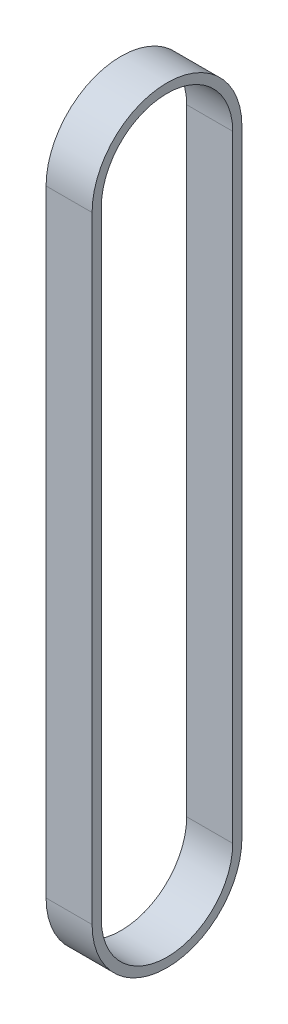
ISO-10303-21;
HEADER;
FILE_DESCRIPTION(('STEP AP214'),'2;1');
FILE_NAME('part.step','',(''),(''),'','','');
FILE_SCHEMA(('AUTOMOTIVE_DESIGN { 1 0 10303 214 1 1 1 1 }'));
ENDSEC;
DATA;
#1=APPLICATION_CONTEXT('core data for automotive mechanical design processes');
#2=APPLICATION_PROTOCOL_DEFINITION('international standard','automotive_design',2000,#1);
#3=PRODUCT_CONTEXT('',#1,'mechanical');
#4=PRODUCT('Part','Part','',(#3));
#5=PRODUCT_RELATED_PRODUCT_CATEGORY('part','',(#4));
#6=PRODUCT_DEFINITION_FORMATION('','',#4);
#7=PRODUCT_DEFINITION_CONTEXT('part definition',#1,'design');
#8=PRODUCT_DEFINITION('design','',#6,#7);
#9=PRODUCT_DEFINITION_SHAPE('','',#8);
#10=(LENGTH_UNIT() NAMED_UNIT(*) SI_UNIT(.MILLI.,.METRE.));
#11=(NAMED_UNIT(*) PLANE_ANGLE_UNIT() SI_UNIT($,.RADIAN.));
#12=(NAMED_UNIT(*) SI_UNIT($,.STERADIAN.) SOLID_ANGLE_UNIT());
#13=UNCERTAINTY_MEASURE_WITH_UNIT(LENGTH_MEASURE(1.E-05),#10,'distance_accuracy_value','');
#14=(GEOMETRIC_REPRESENTATION_CONTEXT(3) GLOBAL_UNCERTAINTY_ASSIGNED_CONTEXT((#13)) GLOBAL_UNIT_ASSIGNED_CONTEXT((#10,
#11,#12)) REPRESENTATION_CONTEXT('',''));
#15=CARTESIAN_POINT('',(0.,0.,0.));
#16=DIRECTION('',(0.,0.,1.));
#17=DIRECTION('',(1.,0.,0.));
#18=AXIS2_PLACEMENT_3D('',#15,#16,#17);
#19=CARTESIAN_POINT('',(3.175,0.,0.));
#20=DIRECTION('',(-1.,0.,0.));
#21=DIRECTION('',(0.,0.,1.));
#22=AXIS2_PLACEMENT_3D('',#19,#20,#21);
#23=PLANE('',#22);
#24=CARTESIAN_POINT('',(3.175,0.,0.));
#25=DIRECTION('',(1.,0.,0.));
#26=DIRECTION('',(0.,0.,1.));
#27=AXIS2_PLACEMENT_3D('',#24,#25,#26);
#28=CIRCLE('',#27,5.1689);
#29=CARTESIAN_POINT('',(3.175,0.,-5.1689));
#30=VERTEX_POINT('',#29);
#31=CARTESIAN_POINT('',(3.175,0.,5.1689));
#32=VERTEX_POINT('',#31);
#33=EDGE_CURVE('E133',#30,#32,#28,.T.);
#34=ORIENTED_EDGE('',*,*,#33,.T.);
#35=DIRECTION('',(0.,-1.,0.));
#36=VECTOR('',#35,1.);
#37=CARTESIAN_POINT('',(3.175,-42.545,5.1689));
#38=LINE('',#37,#36);
#39=CARTESIAN_POINT('',(3.175,-42.545,5.1689));
#40=VERTEX_POINT('',#39);
#41=EDGE_CURVE('E136',#32,#40,#38,.T.);
#42=ORIENTED_EDGE('',*,*,#41,.T.);
#43=CARTESIAN_POINT('',(3.175,-42.545,0.));
#44=DIRECTION('',(1.,0.,0.));
#45=DIRECTION('',(0.,0.,1.));
#46=AXIS2_PLACEMENT_3D('',#43,#44,#45);
#47=CIRCLE('',#46,5.1689);
#48=CARTESIAN_POINT('',(3.175,-42.545,-5.1689));
#49=VERTEX_POINT('',#48);
#50=EDGE_CURVE('E139',#40,#49,#47,.T.);
#51=ORIENTED_EDGE('',*,*,#50,.T.);
#52=DIRECTION('',(0.,1.,0.));
#53=VECTOR('',#52,1.);
#54=CARTESIAN_POINT('',(3.175,0.,-5.1689));
#55=LINE('',#54,#53);
#56=EDGE_CURVE('E141',#49,#30,#55,.T.);
#57=ORIENTED_EDGE('',*,*,#56,.T.);
#58=EDGE_LOOP('',(#34,#42,#51,#57));
#59=FACE_BOUND('',#58,.T.);
#60=CARTESIAN_POINT('',(3.175,0.,0.));
#61=DIRECTION('',(1.,0.,0.));
#62=DIRECTION('',(0.,0.,1.));
#63=AXIS2_PLACEMENT_3D('',#60,#61,#62);
#64=CIRCLE('',#63,4.5339);
#65=CARTESIAN_POINT('',(3.175,0.,-4.5339));
#66=VERTEX_POINT('',#65);
#67=CARTESIAN_POINT('',(3.175,0.,4.5339));
#68=VERTEX_POINT('',#67);
#69=EDGE_CURVE('E97',#66,#68,#64,.T.);
#70=ORIENTED_EDGE('',*,*,#69,.F.);
#71=DIRECTION('',(0.,1.,0.));
#72=VECTOR('',#71,1.);
#73=CARTESIAN_POINT('',(3.175,0.,-4.5339));
#74=LINE('',#73,#72);
#75=CARTESIAN_POINT('',(3.175,-42.545,-4.5339));
#76=VERTEX_POINT('',#75);
#77=EDGE_CURVE('E119',#76,#66,#74,.T.);
#78=ORIENTED_EDGE('',*,*,#77,.F.);
#79=CARTESIAN_POINT('',(3.175,-42.545,0.));
#80=DIRECTION('',(1.,0.,0.));
#81=DIRECTION('',(0.,0.,1.));
#82=AXIS2_PLACEMENT_3D('',#79,#80,#81);
#83=CIRCLE('',#82,4.5339);
#84=CARTESIAN_POINT('',(3.175,-42.545,4.5339));
#85=VERTEX_POINT('',#84);
#86=EDGE_CURVE('E117',#85,#76,#83,.T.);
#87=ORIENTED_EDGE('',*,*,#86,.F.);
#88=DIRECTION('',(0.,-1.,0.));
#89=VECTOR('',#88,1.);
#90=CARTESIAN_POINT('',(3.175,-42.545,4.5339));
#91=LINE('',#90,#89);
#92=EDGE_CURVE('E105',#68,#85,#91,.T.);
#93=ORIENTED_EDGE('',*,*,#92,.F.);
#94=EDGE_LOOP('',(#70,#78,#87,#93));
#95=FACE_BOUND('',#94,.T.);
#96=ADVANCED_FACE('F32',(#59,#95),#23,.F.);
#97=CARTESIAN_POINT('',(0.,0.,0.));
#98=DIRECTION('',(-1.,0.,0.));
#99=DIRECTION('',(0.,0.,1.));
#100=AXIS2_PLACEMENT_3D('',#97,#98,#99);
#101=PLANE('',#100);
#102=CARTESIAN_POINT('',(0.,0.,0.));
#103=DIRECTION('',(1.,0.,0.));
#104=DIRECTION('',(0.,0.,1.));
#105=AXIS2_PLACEMENT_3D('',#102,#103,#104);
#106=CIRCLE('',#105,5.1689);
#107=CARTESIAN_POINT('',(0.,0.,-5.1689));
#108=VERTEX_POINT('',#107);
#109=CARTESIAN_POINT('',(0.,0.,5.1689));
#110=VERTEX_POINT('',#109);
#111=EDGE_CURVE('E113',#108,#110,#106,.T.);
#112=ORIENTED_EDGE('',*,*,#111,.F.);
#113=DIRECTION('',(0.,1.,0.));
#114=VECTOR('',#113,1.);
#115=CARTESIAN_POINT('',(0.,0.,-5.1689));
#116=LINE('',#115,#114);
#117=CARTESIAN_POINT('',(0.,-42.545,-5.1689));
#118=VERTEX_POINT('',#117);
#119=EDGE_CURVE('E137',#118,#108,#116,.T.);
#120=ORIENTED_EDGE('',*,*,#119,.F.);
#121=CARTESIAN_POINT('',(0.,-42.545,0.));
#122=DIRECTION('',(1.,0.,0.));
#123=DIRECTION('',(0.,0.,1.));
#124=AXIS2_PLACEMENT_3D('',#121,#122,#123);
#125=CIRCLE('',#124,5.1689);
#126=CARTESIAN_POINT('',(0.,-42.545,5.1689));
#127=VERTEX_POINT('',#126);
#128=EDGE_CURVE('E148',#127,#118,#125,.T.);
#129=ORIENTED_EDGE('',*,*,#128,.F.);
#130=DIRECTION('',(0.,-1.,0.));
#131=VECTOR('',#130,1.);
#132=CARTESIAN_POINT('',(0.,-42.545,5.1689));
#133=LINE('',#132,#131);
#134=EDGE_CURVE('E146',#110,#127,#133,.T.);
#135=ORIENTED_EDGE('',*,*,#134,.F.);
#136=EDGE_LOOP('',(#112,#120,#129,#135));
#137=FACE_BOUND('',#136,.T.);
#138=DIRECTION('',(0.,1.,0.));
#139=VECTOR('',#138,1.);
#140=CARTESIAN_POINT('',(0.,0.,-4.5339));
#141=LINE('',#140,#139);
#142=CARTESIAN_POINT('',(0.,-42.545,-4.5339));
#143=VERTEX_POINT('',#142);
#144=CARTESIAN_POINT('',(0.,0.,-4.5339));
#145=VERTEX_POINT('',#144);
#146=EDGE_CURVE('E106',#143,#145,#141,.T.);
#147=ORIENTED_EDGE('',*,*,#146,.T.);
#148=CARTESIAN_POINT('',(0.,0.,0.));
#149=DIRECTION('',(1.,0.,0.));
#150=DIRECTION('',(0.,0.,1.));
#151=AXIS2_PLACEMENT_3D('',#148,#149,#150);
#152=CIRCLE('',#151,4.5339);
#153=CARTESIAN_POINT('',(0.,0.,4.5339));
#154=VERTEX_POINT('',#153);
#155=EDGE_CURVE('E55',#145,#154,#152,.T.);
#156=ORIENTED_EDGE('',*,*,#155,.T.);
#157=DIRECTION('',(0.,-1.,0.));
#158=VECTOR('',#157,1.);
#159=CARTESIAN_POINT('',(0.,-42.545,4.5339));
#160=LINE('',#159,#158);
#161=CARTESIAN_POINT('',(0.,-42.545,4.5339));
#162=VERTEX_POINT('',#161);
#163=EDGE_CURVE('E112',#154,#162,#160,.T.);
#164=ORIENTED_EDGE('',*,*,#163,.T.);
#165=CARTESIAN_POINT('',(0.,-42.545,0.));
#166=DIRECTION('',(1.,0.,0.));
#167=DIRECTION('',(0.,0.,1.));
#168=AXIS2_PLACEMENT_3D('',#165,#166,#167);
#169=CIRCLE('',#168,4.5339);
#170=EDGE_CURVE('E125',#162,#143,#169,.T.);
#171=ORIENTED_EDGE('',*,*,#170,.T.);
#172=EDGE_LOOP('',(#147,#156,#164,#171));
#173=FACE_BOUND('',#172,.T.);
#174=ADVANCED_FACE('F166',(#137,#173),#101,.T.);
#175=CARTESIAN_POINT('',(3.175,0.,0.));
#176=DIRECTION('',(-1.,0.,0.));
#177=DIRECTION('',(0.,0.,1.));
#178=AXIS2_PLACEMENT_3D('',#175,#176,#177);
#179=CYLINDRICAL_SURFACE('',#178,5.1689);
#180=ORIENTED_EDGE('',*,*,#111,.T.);
#181=DIRECTION('',(-1.,0.,0.));
#182=VECTOR('',#181,1.);
#183=CARTESIAN_POINT('',(3.175,0.,5.1689));
#184=LINE('',#183,#182);
#185=EDGE_CURVE('E11',#32,#110,#184,.T.);
#186=ORIENTED_EDGE('',*,*,#185,.F.);
#187=ORIENTED_EDGE('',*,*,#33,.F.);
#188=DIRECTION('',(-1.,0.,0.));
#189=VECTOR('',#188,1.);
#190=CARTESIAN_POINT('',(3.175,0.,-5.1689));
#191=LINE('',#190,#189);
#192=EDGE_CURVE('E143',#30,#108,#191,.T.);
#193=ORIENTED_EDGE('',*,*,#192,.T.);
#194=EDGE_LOOP('',(#180,#186,#187,#193));
#195=FACE_BOUND('',#194,.T.);
#196=ADVANCED_FACE('F34',(#195),#179,.T.);
#197=CARTESIAN_POINT('',(3.175,-42.545,5.1689));
#198=DIRECTION('',(0.,0.,-1.));
#199=DIRECTION('',(0.,1.,0.));
#200=AXIS2_PLACEMENT_3D('',#197,#198,#199);
#201=PLANE('',#200);
#202=ORIENTED_EDGE('',*,*,#134,.T.);
#203=DIRECTION('',(-1.,0.,0.));
#204=VECTOR('',#203,1.);
#205=CARTESIAN_POINT('',(3.175,-42.545,5.1689));
#206=LINE('',#205,#204);
#207=EDGE_CURVE('E40',#40,#127,#206,.T.);
#208=ORIENTED_EDGE('',*,*,#207,.F.);
#209=ORIENTED_EDGE('',*,*,#41,.F.);
#210=ORIENTED_EDGE('',*,*,#185,.T.);
#211=EDGE_LOOP('',(#202,#208,#209,#210));
#212=FACE_BOUND('',#211,.T.);
#213=ADVANCED_FACE('F176',(#212),#201,.F.);
#214=CARTESIAN_POINT('',(3.175,-42.545,0.));
#215=DIRECTION('',(-1.,0.,0.));
#216=DIRECTION('',(0.,0.,1.));
#217=AXIS2_PLACEMENT_3D('',#214,#215,#216);
#218=CYLINDRICAL_SURFACE('',#217,5.1689);
#219=ORIENTED_EDGE('',*,*,#128,.T.);
#220=DIRECTION('',(-1.,0.,0.));
#221=VECTOR('',#220,1.);
#222=CARTESIAN_POINT('',(3.175,-42.545,-5.1689));
#223=LINE('',#222,#221);
#224=EDGE_CURVE('E153',#49,#118,#223,.T.);
#225=ORIENTED_EDGE('',*,*,#224,.F.);
#226=ORIENTED_EDGE('',*,*,#50,.F.);
#227=ORIENTED_EDGE('',*,*,#207,.T.);
#228=EDGE_LOOP('',(#219,#225,#226,#227));
#229=FACE_BOUND('',#228,.T.);
#230=ADVANCED_FACE('F160',(#229),#218,.T.);
#231=CARTESIAN_POINT('',(3.175,0.,-5.1689));
#232=DIRECTION('',(0.,0.,1.));
#233=DIRECTION('',(0.,-1.,0.));
#234=AXIS2_PLACEMENT_3D('',#231,#232,#233);
#235=PLANE('',#234);
#236=ORIENTED_EDGE('',*,*,#119,.T.);
#237=ORIENTED_EDGE('',*,*,#192,.F.);
#238=ORIENTED_EDGE('',*,*,#56,.F.);
#239=ORIENTED_EDGE('',*,*,#224,.T.);
#240=EDGE_LOOP('',(#236,#237,#238,#239));
#241=FACE_BOUND('',#240,.T.);
#242=ADVANCED_FACE('F170',(#241),#235,.F.);
#243=CARTESIAN_POINT('',(3.175,0.,0.));
#244=DIRECTION('',(-1.,0.,0.));
#245=DIRECTION('',(0.,0.,1.));
#246=AXIS2_PLACEMENT_3D('',#243,#244,#245);
#247=CYLINDRICAL_SURFACE('',#246,4.5339);
#248=ORIENTED_EDGE('',*,*,#155,.F.);
#249=DIRECTION('',(-1.,0.,0.));
#250=VECTOR('',#249,1.);
#251=CARTESIAN_POINT('',(3.175,0.,-4.5339));
#252=LINE('',#251,#250);
#253=EDGE_CURVE('E101',#66,#145,#252,.T.);
#254=ORIENTED_EDGE('',*,*,#253,.F.);
#255=ORIENTED_EDGE('',*,*,#69,.T.);
#256=DIRECTION('',(-1.,0.,0.));
#257=VECTOR('',#256,1.);
#258=CARTESIAN_POINT('',(3.175,0.,4.5339));
#259=LINE('',#258,#257);
#260=EDGE_CURVE('E100',#68,#154,#259,.T.);
#261=ORIENTED_EDGE('',*,*,#260,.T.);
#262=EDGE_LOOP('',(#248,#254,#255,#261));
#263=FACE_BOUND('',#262,.T.);
#264=ADVANCED_FACE('F99',(#263),#247,.F.);
#265=CARTESIAN_POINT('',(3.175,-42.545,4.5339));
#266=DIRECTION('',(0.,0.,-1.));
#267=DIRECTION('',(0.,1.,0.));
#268=AXIS2_PLACEMENT_3D('',#265,#266,#267);
#269=PLANE('',#268);
#270=ORIENTED_EDGE('',*,*,#163,.F.);
#271=ORIENTED_EDGE('',*,*,#260,.F.);
#272=ORIENTED_EDGE('',*,*,#92,.T.);
#273=DIRECTION('',(-1.,0.,0.));
#274=VECTOR('',#273,1.);
#275=CARTESIAN_POINT('',(3.175,-42.545,4.5339));
#276=LINE('',#275,#274);
#277=EDGE_CURVE('E114',#85,#162,#276,.T.);
#278=ORIENTED_EDGE('',*,*,#277,.T.);
#279=EDGE_LOOP('',(#270,#271,#272,#278));
#280=FACE_BOUND('',#279,.T.);
#281=ADVANCED_FACE('F109',(#280),#269,.T.);
#282=CARTESIAN_POINT('',(3.175,-42.545,0.));
#283=DIRECTION('',(-1.,0.,0.));
#284=DIRECTION('',(0.,0.,1.));
#285=AXIS2_PLACEMENT_3D('',#282,#283,#284);
#286=CYLINDRICAL_SURFACE('',#285,4.5339);
#287=ORIENTED_EDGE('',*,*,#170,.F.);
#288=ORIENTED_EDGE('',*,*,#277,.F.);
#289=ORIENTED_EDGE('',*,*,#86,.T.);
#290=DIRECTION('',(-1.,0.,0.));
#291=VECTOR('',#290,1.);
#292=CARTESIAN_POINT('',(3.175,-42.545,-4.5339));
#293=LINE('',#292,#291);
#294=EDGE_CURVE('E47',#76,#143,#293,.T.);
#295=ORIENTED_EDGE('',*,*,#294,.T.);
#296=EDGE_LOOP('',(#287,#288,#289,#295));
#297=FACE_BOUND('',#296,.T.);
#298=ADVANCED_FACE('F199',(#297),#286,.F.);
#299=CARTESIAN_POINT('',(3.175,0.,-4.5339));
#300=DIRECTION('',(0.,0.,1.));
#301=DIRECTION('',(1.,0.,0.));
#302=AXIS2_PLACEMENT_3D('',#299,#300,#301);
#303=PLANE('',#302);
#304=ORIENTED_EDGE('',*,*,#146,.F.);
#305=ORIENTED_EDGE('',*,*,#294,.F.);
#306=ORIENTED_EDGE('',*,*,#77,.T.);
#307=ORIENTED_EDGE('',*,*,#253,.T.);
#308=EDGE_LOOP('',(#304,#305,#306,#307));
#309=FACE_BOUND('',#308,.T.);
#310=ADVANCED_FACE('F203',(#309),#303,.T.);
#311=CLOSED_SHELL('',(#96,#174,#196,#213,#230,#242,#264,#281,#298,#310));
#312=MANIFOLD_SOLID_BREP('B2',#311);
#313=ADVANCED_BREP_SHAPE_REPRESENTATION('',(#18,#312),#14);
#314=SHAPE_DEFINITION_REPRESENTATION(#9,#313);
ENDSEC;
END-ISO-10303-21;
